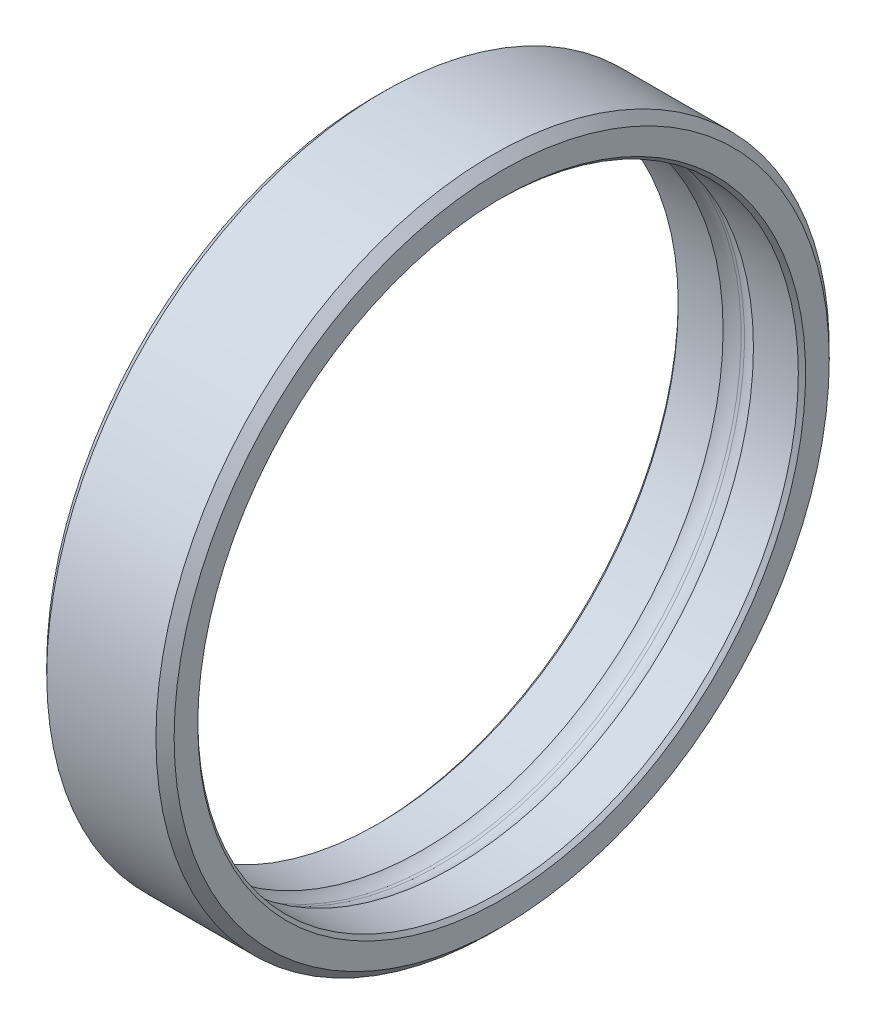
ISO-10303-21;
HEADER;
FILE_DESCRIPTION(('STEP AP214'),'2;1');
FILE_NAME('part.step','',(''),(''),'','','');
FILE_SCHEMA(('AUTOMOTIVE_DESIGN { 1 0 10303 214 1 1 1 1 }'));
ENDSEC;
DATA;
#1=APPLICATION_CONTEXT('core data for automotive mechanical design processes');
#2=APPLICATION_PROTOCOL_DEFINITION('international standard','automotive_design',2000,#1);
#3=PRODUCT_CONTEXT('',#1,'mechanical');
#4=PRODUCT('Part','Part','',(#3));
#5=PRODUCT_RELATED_PRODUCT_CATEGORY('part','',(#4));
#6=PRODUCT_DEFINITION_FORMATION('','',#4);
#7=PRODUCT_DEFINITION_CONTEXT('part definition',#1,'design');
#8=PRODUCT_DEFINITION('design','',#6,#7);
#9=PRODUCT_DEFINITION_SHAPE('','',#8);
#10=(LENGTH_UNIT() NAMED_UNIT(*) SI_UNIT(.MILLI.,.METRE.));
#11=(NAMED_UNIT(*) PLANE_ANGLE_UNIT() SI_UNIT($,.RADIAN.));
#12=(NAMED_UNIT(*) SI_UNIT($,.STERADIAN.) SOLID_ANGLE_UNIT());
#13=UNCERTAINTY_MEASURE_WITH_UNIT(LENGTH_MEASURE(1.E-05),#10,'distance_accuracy_value','');
#14=(GEOMETRIC_REPRESENTATION_CONTEXT(3) GLOBAL_UNCERTAINTY_ASSIGNED_CONTEXT((#13)) GLOBAL_UNIT_ASSIGNED_CONTEXT((#10,
#11,#12)) REPRESENTATION_CONTEXT('',''));
#15=CARTESIAN_POINT('',(0.,0.,0.));
#16=DIRECTION('',(0.,0.,1.));
#17=DIRECTION('',(1.,0.,0.));
#18=AXIS2_PLACEMENT_3D('',#15,#16,#17);
#19=CARTESIAN_POINT('',(-3.5,16.5,0.));
#20=DIRECTION('',(1.,0.,0.));
#21=DIRECTION('',(0.,0.,-1.));
#22=AXIS2_PLACEMENT_3D('',#19,#20,#21);
#23=PLANE('',#22);
#24=CARTESIAN_POINT('',(-3.5,0.,0.));
#25=DIRECTION('',(1.,0.,0.));
#26=DIRECTION('',(0.,0.,-1.));
#27=AXIS2_PLACEMENT_3D('',#24,#25,#26);
#28=CIRCLE('',#27,16.7);
#29=CARTESIAN_POINT('',(-3.5,0.,-16.7));
#30=VERTEX_POINT('',#29);
#31=EDGE_CURVE('E43',#30,#30,#28,.T.);
#32=ORIENTED_EDGE('',*,*,#31,.T.);
#33=EDGE_LOOP('',(#32));
#34=FACE_BOUND('',#33,.T.);
#35=CARTESIAN_POINT('',(-3.5,0.,0.));
#36=DIRECTION('',(1.,0.,0.));
#37=DIRECTION('',(0.,0.,-1.));
#38=AXIS2_PLACEMENT_3D('',#35,#36,#37);
#39=CIRCLE('',#38,18.);
#40=CARTESIAN_POINT('',(-3.5,0.,-18.));
#41=VERTEX_POINT('',#40);
#42=EDGE_CURVE('E52',#41,#41,#39,.F.);
#43=ORIENTED_EDGE('',*,*,#42,.T.);
#44=EDGE_LOOP('',(#43));
#45=FACE_BOUND('',#44,.T.);
#46=ADVANCED_FACE('F32',(#34,#45),#23,.F.);
#47=CARTESIAN_POINT('',(0.,0.,0.));
#48=DIRECTION('',(-1.,0.,0.));
#49=DIRECTION('',(0.,0.,1.));
#50=AXIS2_PLACEMENT_3D('',#47,#48,#49);
#51=CYLINDRICAL_SURFACE('',#50,16.5);
#52=CARTESIAN_POINT('',(-3.29999999999998,0.,0.));
#53=DIRECTION('',(1.,0.,0.));
#54=DIRECTION('',(0.,0.,-1.));
#55=AXIS2_PLACEMENT_3D('',#52,#53,#54);
#56=CIRCLE('',#55,16.5);
#57=CARTESIAN_POINT('',(-3.29999999999998,0.,-16.5));
#58=VERTEX_POINT('',#57);
#59=EDGE_CURVE('E47',#58,#58,#56,.F.);
#60=ORIENTED_EDGE('',*,*,#59,.T.);
#61=EDGE_LOOP('',(#60));
#62=FACE_BOUND('',#61,.T.);
#63=CARTESIAN_POINT('',(-0.83336884491535,0.,0.));
#64=DIRECTION('',(-1.,0.,0.));
#65=DIRECTION('',(0.,0.,1.));
#66=AXIS2_PLACEMENT_3D('',#63,#64,#65);
#67=CIRCLE('',#66,16.5);
#68=CARTESIAN_POINT('',(-0.83336884491535,0.,16.5));
#69=VERTEX_POINT('',#68);
#70=EDGE_CURVE('E64',#69,#69,#67,.T.);
#71=ORIENTED_EDGE('',*,*,#70,.F.);
#72=EDGE_LOOP('',(#71));
#73=FACE_BOUND('',#72,.T.);
#74=ADVANCED_FACE('F94',(#62,#73),#51,.F.);
#75=CARTESIAN_POINT('',(0.,0.,0.));
#76=DIRECTION('',(-1.,0.,0.));
#77=DIRECTION('',(0.,0.,1.));
#78=AXIS2_PLACEMENT_3D('',#75,#76,#77);
#79=TOROIDAL_SURFACE('',#78,15.2528045989804,1.50000000000001);
#80=CARTESIAN_POINT('',(-0.0916838653515002,0.,0.));
#81=DIRECTION('',(-1.,0.,0.));
#82=DIRECTION('',(0.,0.,1.));
#83=AXIS2_PLACEMENT_3D('',#80,#81,#82);
#84=CIRCLE('',#83,16.75);
#85=CARTESIAN_POINT('',(-0.0916838653515002,0.,16.75));
#86=VERTEX_POINT('',#85);
#87=EDGE_CURVE('E67',#86,#86,#84,.T.);
#88=ORIENTED_EDGE('',*,*,#87,.F.);
#89=EDGE_LOOP('',(#88));
#90=FACE_BOUND('',#89,.T.);
#91=ORIENTED_EDGE('',*,*,#70,.T.);
#92=EDGE_LOOP('',(#91));
#93=FACE_BOUND('',#92,.T.);
#94=ADVANCED_FACE('F88',(#90,#93),#79,.F.);
#95=CARTESIAN_POINT('',(0.,0.,0.));
#96=DIRECTION('',(-1.,0.,0.));
#97=DIRECTION('',(0.,0.,1.));
#98=AXIS2_PLACEMENT_3D('',#95,#96,#97);
#99=CYLINDRICAL_SURFACE('',#98,16.75);
#100=CARTESIAN_POINT('',(0.0916838653515007,0.,0.));
#101=DIRECTION('',(-1.,0.,0.));
#102=DIRECTION('',(0.,0.,1.));
#103=AXIS2_PLACEMENT_3D('',#100,#101,#102);
#104=CIRCLE('',#103,16.75);
#105=CARTESIAN_POINT('',(0.0916838653515007,0.,16.75));
#106=VERTEX_POINT('',#105);
#107=EDGE_CURVE('E70',#106,#106,#104,.T.);
#108=ORIENTED_EDGE('',*,*,#107,.F.);
#109=EDGE_LOOP('',(#108));
#110=FACE_BOUND('',#109,.T.);
#111=ORIENTED_EDGE('',*,*,#87,.T.);
#112=EDGE_LOOP('',(#111));
#113=FACE_BOUND('',#112,.T.);
#114=ADVANCED_FACE('F82',(#110,#113),#99,.F.);
#115=CARTESIAN_POINT('',(0.,0.,0.));
#116=DIRECTION('',(-1.,0.,0.));
#117=DIRECTION('',(0.,0.,1.));
#118=AXIS2_PLACEMENT_3D('',#115,#116,#117);
#119=TOROIDAL_SURFACE('',#118,15.2528045989804,1.50000000000001);
#120=CARTESIAN_POINT('',(0.833368844915355,0.,0.));
#121=DIRECTION('',(-1.,0.,0.));
#122=DIRECTION('',(0.,0.,1.));
#123=AXIS2_PLACEMENT_3D('',#120,#121,#122);
#124=CIRCLE('',#123,16.5);
#125=CARTESIAN_POINT('',(0.833368844915355,0.,16.5));
#126=VERTEX_POINT('',#125);
#127=EDGE_CURVE('E73',#126,#126,#124,.T.);
#128=ORIENTED_EDGE('',*,*,#127,.F.);
#129=EDGE_LOOP('',(#128));
#130=FACE_BOUND('',#129,.T.);
#131=ORIENTED_EDGE('',*,*,#107,.T.);
#132=EDGE_LOOP('',(#131));
#133=FACE_BOUND('',#132,.T.);
#134=ADVANCED_FACE('F79',(#130,#133),#119,.F.);
#135=CARTESIAN_POINT('',(0.,0.,0.));
#136=DIRECTION('',(-1.,0.,0.));
#137=DIRECTION('',(0.,0.,1.));
#138=AXIS2_PLACEMENT_3D('',#135,#136,#137);
#139=CYLINDRICAL_SURFACE('',#138,16.5);
#140=CARTESIAN_POINT('',(3.29999999999999,0.,0.));
#141=DIRECTION('',(-1.,0.,0.));
#142=DIRECTION('',(0.,0.,1.));
#143=AXIS2_PLACEMENT_3D('',#140,#141,#142);
#144=CIRCLE('',#143,16.5);
#145=CARTESIAN_POINT('',(3.29999999999999,0.,16.5));
#146=VERTEX_POINT('',#145);
#147=EDGE_CURVE('E10',#146,#146,#144,.F.);
#148=ORIENTED_EDGE('',*,*,#147,.T.);
#149=EDGE_LOOP('',(#148));
#150=FACE_BOUND('',#149,.T.);
#151=ORIENTED_EDGE('',*,*,#127,.T.);
#152=EDGE_LOOP('',(#151));
#153=FACE_BOUND('',#152,.T.);
#154=ADVANCED_FACE('F77',(#150,#153),#139,.F.);
#155=CARTESIAN_POINT('',(3.5,16.5,0.));
#156=DIRECTION('',(-1.,0.,0.));
#157=DIRECTION('',(0.,0.,1.));
#158=AXIS2_PLACEMENT_3D('',#155,#156,#157);
#159=PLANE('',#158);
#160=CARTESIAN_POINT('',(3.5,0.,0.));
#161=DIRECTION('',(-1.,0.,0.));
#162=DIRECTION('',(0.,0.,1.));
#163=AXIS2_PLACEMENT_3D('',#160,#161,#162);
#164=CIRCLE('',#163,16.7);
#165=CARTESIAN_POINT('',(3.5,0.,16.7));
#166=VERTEX_POINT('',#165);
#167=EDGE_CURVE('E39',#166,#166,#164,.T.);
#168=ORIENTED_EDGE('',*,*,#167,.T.);
#169=EDGE_LOOP('',(#168));
#170=FACE_BOUND('',#169,.T.);
#171=CARTESIAN_POINT('',(3.5,0.,0.));
#172=DIRECTION('',(-1.,0.,0.));
#173=DIRECTION('',(0.,0.,1.));
#174=AXIS2_PLACEMENT_3D('',#171,#172,#173);
#175=CIRCLE('',#174,18.);
#176=CARTESIAN_POINT('',(3.5,0.,18.));
#177=VERTEX_POINT('',#176);
#178=EDGE_CURVE('E55',#177,#177,#175,.F.);
#179=ORIENTED_EDGE('',*,*,#178,.T.);
#180=EDGE_LOOP('',(#179));
#181=FACE_BOUND('',#180,.T.);
#182=ADVANCED_FACE('F141',(#170,#181),#159,.F.);
#183=CARTESIAN_POINT('',(0.,0.,0.));
#184=DIRECTION('',(-1.,0.,0.));
#185=DIRECTION('',(0.,0.,1.));
#186=AXIS2_PLACEMENT_3D('',#183,#184,#185);
#187=CYLINDRICAL_SURFACE('',#186,18.5);
#188=CARTESIAN_POINT('',(2.99999999999999,0.,0.));
#189=DIRECTION('',(-1.,0.,0.));
#190=DIRECTION('',(0.,0.,1.));
#191=AXIS2_PLACEMENT_3D('',#188,#189,#190);
#192=CIRCLE('',#191,18.5);
#193=CARTESIAN_POINT('',(2.99999999999999,0.,18.5));
#194=VERTEX_POINT('',#193);
#195=EDGE_CURVE('E58',#194,#194,#192,.T.);
#196=ORIENTED_EDGE('',*,*,#195,.T.);
#197=EDGE_LOOP('',(#196));
#198=FACE_BOUND('',#197,.T.);
#199=CARTESIAN_POINT('',(-2.99999999999999,0.,0.));
#200=DIRECTION('',(1.,0.,0.));
#201=DIRECTION('',(0.,0.,-1.));
#202=AXIS2_PLACEMENT_3D('',#199,#200,#201);
#203=CIRCLE('',#202,18.5);
#204=CARTESIAN_POINT('',(-2.99999999999999,0.,-18.5));
#205=VERTEX_POINT('',#204);
#206=EDGE_CURVE('E61',#205,#205,#203,.T.);
#207=ORIENTED_EDGE('',*,*,#206,.T.);
#208=EDGE_LOOP('',(#207));
#209=FACE_BOUND('',#208,.T.);
#210=ADVANCED_FACE('F111',(#198,#209),#187,.T.);
#211=CARTESIAN_POINT('',(2.99999999999999,0.,0.));
#212=DIRECTION('',(-1.,0.,0.));
#213=DIRECTION('',(0.,0.,1.));
#214=AXIS2_PLACEMENT_3D('',#211,#212,#213);
#215=CONICAL_SURFACE('',#214,18.5,0.785398163397448);
#216=ORIENTED_EDGE('',*,*,#178,.F.);
#217=EDGE_LOOP('',(#216));
#218=FACE_BOUND('',#217,.T.);
#219=ORIENTED_EDGE('',*,*,#195,.F.);
#220=EDGE_LOOP('',(#219));
#221=FACE_BOUND('',#220,.T.);
#222=ADVANCED_FACE('F107',(#218,#221),#215,.T.);
#223=CARTESIAN_POINT('',(-3.5,0.,0.));
#224=DIRECTION('',(1.,0.,0.));
#225=DIRECTION('',(0.,0.,-1.));
#226=AXIS2_PLACEMENT_3D('',#223,#224,#225);
#227=CONICAL_SURFACE('',#226,18.,0.785398163397441);
#228=ORIENTED_EDGE('',*,*,#206,.F.);
#229=EDGE_LOOP('',(#228));
#230=FACE_BOUND('',#229,.T.);
#231=ORIENTED_EDGE('',*,*,#42,.F.);
#232=EDGE_LOOP('',(#231));
#233=FACE_BOUND('',#232,.T.);
#234=ADVANCED_FACE('F110',(#230,#233),#227,.T.);
#235=CARTESIAN_POINT('',(-3.29999999999998,0.,0.));
#236=DIRECTION('',(-1.,0.,0.));
#237=DIRECTION('',(0.,0.,1.));
#238=AXIS2_PLACEMENT_3D('',#235,#236,#237);
#239=CONICAL_SURFACE('',#238,16.5,0.785398163397448);
#240=ORIENTED_EDGE('',*,*,#31,.F.);
#241=EDGE_LOOP('',(#240));
#242=FACE_BOUND('',#241,.T.);
#243=ORIENTED_EDGE('',*,*,#59,.F.);
#244=EDGE_LOOP('',(#243));
#245=FACE_BOUND('',#244,.T.);
#246=ADVANCED_FACE('F114',(#242,#245),#239,.F.);
#247=CARTESIAN_POINT('',(3.5,0.,0.));
#248=DIRECTION('',(1.,0.,0.));
#249=DIRECTION('',(0.,0.,-1.));
#250=AXIS2_PLACEMENT_3D('',#247,#248,#249);
#251=CONICAL_SURFACE('',#250,16.7,0.785398163397448);
#252=ORIENTED_EDGE('',*,*,#147,.F.);
#253=EDGE_LOOP('',(#252));
#254=FACE_BOUND('',#253,.T.);
#255=ORIENTED_EDGE('',*,*,#167,.F.);
#256=EDGE_LOOP('',(#255));
#257=FACE_BOUND('',#256,.T.);
#258=ADVANCED_FACE('F34',(#254,#257),#251,.F.);
#259=CLOSED_SHELL('',(#46,#74,#94,#114,#134,#154,#182,#210,#222,#234,#246,#258));
#260=MANIFOLD_SOLID_BREP('B2',#259);
#261=ADVANCED_BREP_SHAPE_REPRESENTATION('',(#18,#260),#14);
#262=SHAPE_DEFINITION_REPRESENTATION(#9,#261);
ENDSEC;
END-ISO-10303-21;
